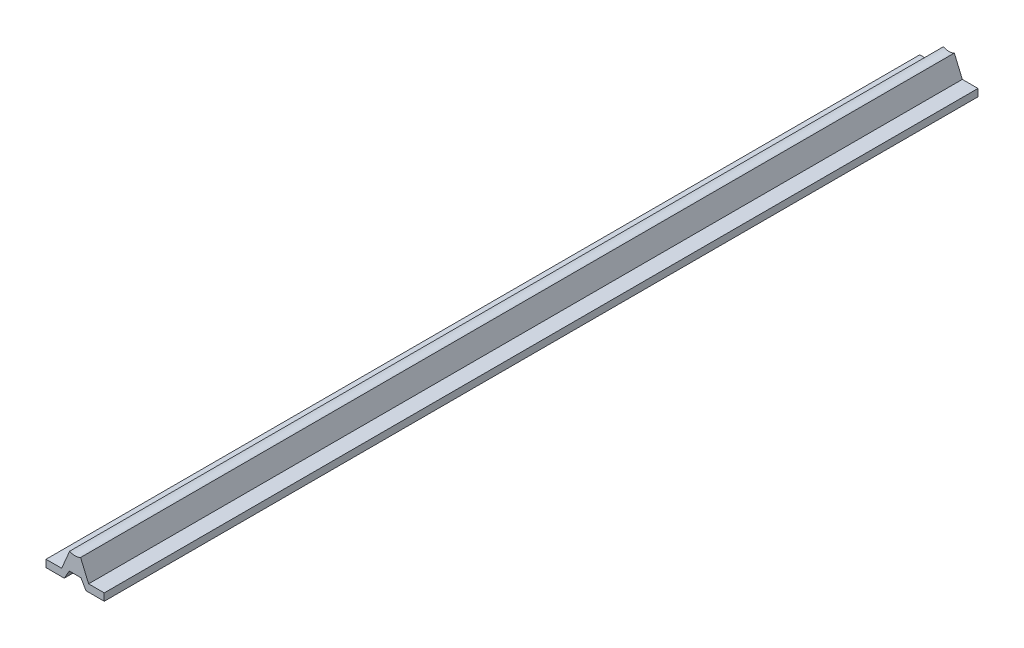
ISO-10303-21;
HEADER;
FILE_DESCRIPTION(('STEP AP214'),'2;1');
FILE_NAME('part.step','',(''),(''),'','','');
FILE_SCHEMA(('AUTOMOTIVE_DESIGN { 1 0 10303 214 1 1 1 1 }'));
ENDSEC;
DATA;
#1=APPLICATION_CONTEXT('core data for automotive mechanical design processes');
#2=APPLICATION_PROTOCOL_DEFINITION('international standard','automotive_design',2000,#1);
#3=PRODUCT_CONTEXT('',#1,'mechanical');
#4=PRODUCT('Part','Part','',(#3));
#5=PRODUCT_RELATED_PRODUCT_CATEGORY('part','',(#4));
#6=PRODUCT_DEFINITION_FORMATION('','',#4);
#7=PRODUCT_DEFINITION_CONTEXT('part definition',#1,'design');
#8=PRODUCT_DEFINITION('design','',#6,#7);
#9=PRODUCT_DEFINITION_SHAPE('','',#8);
#10=(LENGTH_UNIT() NAMED_UNIT(*) SI_UNIT(.MILLI.,.METRE.));
#11=(NAMED_UNIT(*) PLANE_ANGLE_UNIT() SI_UNIT($,.RADIAN.));
#12=(NAMED_UNIT(*) SI_UNIT($,.STERADIAN.) SOLID_ANGLE_UNIT());
#13=UNCERTAINTY_MEASURE_WITH_UNIT(LENGTH_MEASURE(1.E-05),#10,'distance_accuracy_value','');
#14=(GEOMETRIC_REPRESENTATION_CONTEXT(3) GLOBAL_UNCERTAINTY_ASSIGNED_CONTEXT((#13)) GLOBAL_UNIT_ASSIGNED_CONTEXT((#10,
#11,#12)) REPRESENTATION_CONTEXT('',''));
#15=CARTESIAN_POINT('',(0.,0.,0.));
#16=DIRECTION('',(0.,0.,1.));
#17=DIRECTION('',(1.,0.,0.));
#18=AXIS2_PLACEMENT_3D('',#15,#16,#17);
#19=CARTESIAN_POINT('',(-20.,-25.,600.));
#20=DIRECTION('',(1.,0.,0.));
#21=DIRECTION('',(0.,0.,-1.));
#22=AXIS2_PLACEMENT_3D('',#19,#20,#21);
#23=PLANE('',#22);
#24=DIRECTION('',(0.,-1.,0.));
#25=VECTOR('',#24,1.);
#26=CARTESIAN_POINT('',(-20.,-25.,0.));
#27=LINE('',#26,#25);
#28=CARTESIAN_POINT('',(-20.,-20.,0.));
#29=VERTEX_POINT('',#28);
#30=CARTESIAN_POINT('',(-20.,-25.,0.));
#31=VERTEX_POINT('',#30);
#32=EDGE_CURVE('E153',#29,#31,#27,.T.);
#33=ORIENTED_EDGE('',*,*,#32,.T.);
#34=DIRECTION('',(0.,0.,-1.));
#35=VECTOR('',#34,1.);
#36=CARTESIAN_POINT('',(-20.,-25.,600.));
#37=LINE('',#36,#35);
#38=CARTESIAN_POINT('',(-20.,-25.,600.));
#39=VERTEX_POINT('',#38);
#40=EDGE_CURVE('E11',#39,#31,#37,.T.);
#41=ORIENTED_EDGE('',*,*,#40,.F.);
#42=DIRECTION('',(0.,-1.,0.));
#43=VECTOR('',#42,1.);
#44=CARTESIAN_POINT('',(-20.,-25.,600.));
#45=LINE('',#44,#43);
#46=CARTESIAN_POINT('',(-20.,-20.,600.));
#47=VERTEX_POINT('',#46);
#48=EDGE_CURVE('E175',#47,#39,#45,.T.);
#49=ORIENTED_EDGE('',*,*,#48,.F.);
#50=DIRECTION('',(0.,0.,-1.));
#51=VECTOR('',#50,1.);
#52=CARTESIAN_POINT('',(-20.,-20.,600.));
#53=LINE('',#52,#51);
#54=EDGE_CURVE('E149',#47,#29,#53,.T.);
#55=ORIENTED_EDGE('',*,*,#54,.T.);
#56=EDGE_LOOP('',(#33,#41,#49,#55));
#57=FACE_BOUND('',#56,.T.);
#58=ADVANCED_FACE('F33',(#57),#23,.F.);
#59=CARTESIAN_POINT('',(-20.,-25.,600.));
#60=DIRECTION('',(0.,1.,0.));
#61=DIRECTION('',(0.,0.,1.));
#62=AXIS2_PLACEMENT_3D('',#59,#60,#61);
#63=PLANE('',#62);
#64=DIRECTION('',(1.,0.,0.));
#65=VECTOR('',#64,1.);
#66=CARTESIAN_POINT('',(-20.,-25.,0.));
#67=LINE('',#66,#65);
#68=CARTESIAN_POINT('',(-7.46410161513775,-25.,0.));
#69=VERTEX_POINT('',#68);
#70=EDGE_CURVE('E156',#31,#69,#67,.T.);
#71=ORIENTED_EDGE('',*,*,#70,.T.);
#72=DIRECTION('',(0.,0.,-1.));
#73=VECTOR('',#72,1.);
#74=CARTESIAN_POINT('',(-7.46410161513775,-25.,600.));
#75=LINE('',#74,#73);
#76=CARTESIAN_POINT('',(-7.46410161513775,-25.,600.));
#77=VERTEX_POINT('',#76);
#78=EDGE_CURVE('E41',#77,#69,#75,.T.);
#79=ORIENTED_EDGE('',*,*,#78,.F.);
#80=DIRECTION('',(1.,0.,0.));
#81=VECTOR('',#80,1.);
#82=CARTESIAN_POINT('',(-20.,-25.,600.));
#83=LINE('',#82,#81);
#84=EDGE_CURVE('E104',#39,#77,#83,.T.);
#85=ORIENTED_EDGE('',*,*,#84,.F.);
#86=ORIENTED_EDGE('',*,*,#40,.T.);
#87=EDGE_LOOP('',(#71,#79,#85,#86));
#88=FACE_BOUND('',#87,.T.);
#89=ADVANCED_FACE('F253',(#88),#63,.F.);
#90=CARTESIAN_POINT('',(-7.46410161513775,-25.,600.));
#91=DIRECTION('',(-0.866025403784439,0.5,0.));
#92=DIRECTION('',(-0.5,-0.866025403784439,0.));
#93=AXIS2_PLACEMENT_3D('',#90,#91,#92);
#94=PLANE('',#93);
#95=DIRECTION('',(0.5,0.866025403784439,0.));
#96=VECTOR('',#95,1.);
#97=CARTESIAN_POINT('',(-7.46410161513775,-25.,0.));
#98=LINE('',#97,#96);
#99=CARTESIAN_POINT('',(-4.,-19.,0.));
#100=VERTEX_POINT('',#99);
#101=EDGE_CURVE('E158',#69,#100,#98,.T.);
#102=ORIENTED_EDGE('',*,*,#101,.T.);
#103=DIRECTION('',(0.,0.,-1.));
#104=VECTOR('',#103,1.);
#105=CARTESIAN_POINT('',(-4.,-19.,600.));
#106=LINE('',#105,#104);
#107=CARTESIAN_POINT('',(-4.,-19.,600.));
#108=VERTEX_POINT('',#107);
#109=EDGE_CURVE('E194',#108,#100,#106,.T.);
#110=ORIENTED_EDGE('',*,*,#109,.F.);
#111=DIRECTION('',(0.5,0.866025403784439,0.));
#112=VECTOR('',#111,1.);
#113=CARTESIAN_POINT('',(-7.46410161513775,-25.,600.));
#114=LINE('',#113,#112);
#115=EDGE_CURVE('E202',#77,#108,#114,.T.);
#116=ORIENTED_EDGE('',*,*,#115,.F.);
#117=ORIENTED_EDGE('',*,*,#78,.T.);
#118=EDGE_LOOP('',(#102,#110,#116,#117));
#119=FACE_BOUND('',#118,.T.);
#120=ADVANCED_FACE('F200',(#119),#94,.F.);
#121=CARTESIAN_POINT('',(-4.,-19.,600.));
#122=DIRECTION('',(0.,1.,0.));
#123=DIRECTION('',(0.,0.,1.));
#124=AXIS2_PLACEMENT_3D('',#121,#122,#123);
#125=PLANE('',#124);
#126=DIRECTION('',(1.,0.,0.));
#127=VECTOR('',#126,1.);
#128=CARTESIAN_POINT('',(-4.,-19.,0.));
#129=LINE('',#128,#127);
#130=CARTESIAN_POINT('',(4.,-19.,0.));
#131=VERTEX_POINT('',#130);
#132=EDGE_CURVE('E160',#100,#131,#129,.T.);
#133=ORIENTED_EDGE('',*,*,#132,.T.);
#134=DIRECTION('',(0.,0.,-1.));
#135=VECTOR('',#134,1.);
#136=CARTESIAN_POINT('',(4.,-19.,600.));
#137=LINE('',#136,#135);
#138=CARTESIAN_POINT('',(4.,-19.,600.));
#139=VERTEX_POINT('',#138);
#140=EDGE_CURVE('E191',#139,#131,#137,.T.);
#141=ORIENTED_EDGE('',*,*,#140,.F.);
#142=DIRECTION('',(1.,0.,0.));
#143=VECTOR('',#142,1.);
#144=CARTESIAN_POINT('',(-4.,-19.,600.));
#145=LINE('',#144,#143);
#146=EDGE_CURVE('E220',#108,#139,#145,.T.);
#147=ORIENTED_EDGE('',*,*,#146,.F.);
#148=ORIENTED_EDGE('',*,*,#109,.T.);
#149=EDGE_LOOP('',(#133,#141,#147,#148));
#150=FACE_BOUND('',#149,.T.);
#151=ADVANCED_FACE('F211',(#150),#125,.F.);
#152=CARTESIAN_POINT('',(4.,-19.,600.));
#153=DIRECTION('',(0.866025403784439,0.499999999999999,0.));
#154=DIRECTION('',(-0.499999999999999,0.866025403784439,0.));
#155=AXIS2_PLACEMENT_3D('',#152,#153,#154);
#156=PLANE('',#155);
#157=DIRECTION('',(0.499999999999999,-0.866025403784439,0.));
#158=VECTOR('',#157,1.);
#159=CARTESIAN_POINT('',(4.,-19.,0.));
#160=LINE('',#159,#158);
#161=CARTESIAN_POINT('',(7.46410161513775,-25.,0.));
#162=VERTEX_POINT('',#161);
#163=EDGE_CURVE('E162',#131,#162,#160,.T.);
#164=ORIENTED_EDGE('',*,*,#163,.T.);
#165=DIRECTION('',(0.,0.,-1.));
#166=VECTOR('',#165,1.);
#167=CARTESIAN_POINT('',(7.46410161513775,-25.,600.));
#168=LINE('',#167,#166);
#169=CARTESIAN_POINT('',(7.46410161513775,-25.,600.));
#170=VERTEX_POINT('',#169);
#171=EDGE_CURVE('E188',#170,#162,#168,.T.);
#172=ORIENTED_EDGE('',*,*,#171,.F.);
#173=DIRECTION('',(0.499999999999999,-0.866025403784439,0.));
#174=VECTOR('',#173,1.);
#175=CARTESIAN_POINT('',(4.,-19.,600.));
#176=LINE('',#175,#174);
#177=EDGE_CURVE('E217',#139,#170,#176,.T.);
#178=ORIENTED_EDGE('',*,*,#177,.F.);
#179=ORIENTED_EDGE('',*,*,#140,.T.);
#180=EDGE_LOOP('',(#164,#172,#178,#179));
#181=FACE_BOUND('',#180,.T.);
#182=ADVANCED_FACE('F215',(#181),#156,.F.);
#183=CARTESIAN_POINT('',(7.46410161513775,-25.,600.));
#184=DIRECTION('',(0.,1.,0.));
#185=DIRECTION('',(-1.,0.,0.));
#186=AXIS2_PLACEMENT_3D('',#183,#184,#185);
#187=PLANE('',#186);
#188=DIRECTION('',(1.,0.,0.));
#189=VECTOR('',#188,1.);
#190=CARTESIAN_POINT('',(7.46410161513775,-25.,0.));
#191=LINE('',#190,#189);
#192=CARTESIAN_POINT('',(20.,-25.,0.));
#193=VERTEX_POINT('',#192);
#194=EDGE_CURVE('E164',#162,#193,#191,.T.);
#195=ORIENTED_EDGE('',*,*,#194,.T.);
#196=DIRECTION('',(0.,0.,-1.));
#197=VECTOR('',#196,1.);
#198=CARTESIAN_POINT('',(20.,-25.,600.));
#199=LINE('',#198,#197);
#200=CARTESIAN_POINT('',(20.,-25.,600.));
#201=VERTEX_POINT('',#200);
#202=EDGE_CURVE('E185',#201,#193,#199,.T.);
#203=ORIENTED_EDGE('',*,*,#202,.F.);
#204=DIRECTION('',(1.,0.,0.));
#205=VECTOR('',#204,1.);
#206=CARTESIAN_POINT('',(7.46410161513775,-25.,600.));
#207=LINE('',#206,#205);
#208=EDGE_CURVE('E219',#170,#201,#207,.T.);
#209=ORIENTED_EDGE('',*,*,#208,.F.);
#210=ORIENTED_EDGE('',*,*,#171,.T.);
#211=EDGE_LOOP('',(#195,#203,#209,#210));
#212=FACE_BOUND('',#211,.T.);
#213=ADVANCED_FACE('F266',(#212),#187,.F.);
#214=CARTESIAN_POINT('',(20.,-25.,600.));
#215=DIRECTION('',(-1.,0.,0.));
#216=DIRECTION('',(0.,0.,1.));
#217=AXIS2_PLACEMENT_3D('',#214,#215,#216);
#218=PLANE('',#217);
#219=DIRECTION('',(0.,1.,0.));
#220=VECTOR('',#219,1.);
#221=CARTESIAN_POINT('',(20.,-25.,0.));
#222=LINE('',#221,#220);
#223=CARTESIAN_POINT('',(20.,-20.,0.));
#224=VERTEX_POINT('',#223);
#225=EDGE_CURVE('E166',#193,#224,#222,.T.);
#226=ORIENTED_EDGE('',*,*,#225,.T.);
#227=DIRECTION('',(0.,0.,-1.));
#228=VECTOR('',#227,1.);
#229=CARTESIAN_POINT('',(20.,-20.,600.));
#230=LINE('',#229,#228);
#231=CARTESIAN_POINT('',(20.,-20.,600.));
#232=VERTEX_POINT('',#231);
#233=EDGE_CURVE('E182',#232,#224,#230,.T.);
#234=ORIENTED_EDGE('',*,*,#233,.F.);
#235=DIRECTION('',(0.,1.,0.));
#236=VECTOR('',#235,1.);
#237=CARTESIAN_POINT('',(20.,-25.,600.));
#238=LINE('',#237,#236);
#239=EDGE_CURVE('E222',#201,#232,#238,.T.);
#240=ORIENTED_EDGE('',*,*,#239,.F.);
#241=ORIENTED_EDGE('',*,*,#202,.T.);
#242=EDGE_LOOP('',(#226,#234,#240,#241));
#243=FACE_BOUND('',#242,.T.);
#244=ADVANCED_FACE('F269',(#243),#218,.F.);
#245=CARTESIAN_POINT('',(20.,-20.,600.));
#246=DIRECTION('',(0.,-1.,0.));
#247=DIRECTION('',(0.,0.,-1.));
#248=AXIS2_PLACEMENT_3D('',#245,#246,#247);
#249=PLANE('',#248);
#250=DIRECTION('',(-1.,0.,0.));
#251=VECTOR('',#250,1.);
#252=CARTESIAN_POINT('',(20.,-20.,0.));
#253=LINE('',#252,#251);
#254=CARTESIAN_POINT('',(9.25,-20.,0.));
#255=VERTEX_POINT('',#254);
#256=EDGE_CURVE('E168',#224,#255,#253,.T.);
#257=ORIENTED_EDGE('',*,*,#256,.T.);
#258=DIRECTION('',(0.,0.,-1.));
#259=VECTOR('',#258,1.);
#260=CARTESIAN_POINT('',(9.25,-20.,600.));
#261=LINE('',#260,#259);
#262=CARTESIAN_POINT('',(9.25,-20.,600.));
#263=VERTEX_POINT('',#262);
#264=EDGE_CURVE('E179',#263,#255,#261,.T.);
#265=ORIENTED_EDGE('',*,*,#264,.F.);
#266=DIRECTION('',(-1.,0.,0.));
#267=VECTOR('',#266,1.);
#268=CARTESIAN_POINT('',(20.,-20.,600.));
#269=LINE('',#268,#267);
#270=EDGE_CURVE('E228',#232,#263,#269,.T.);
#271=ORIENTED_EDGE('',*,*,#270,.F.);
#272=ORIENTED_EDGE('',*,*,#233,.T.);
#273=EDGE_LOOP('',(#257,#265,#271,#272));
#274=FACE_BOUND('',#273,.T.);
#275=ADVANCED_FACE('F234',(#274),#249,.F.);
#276=CARTESIAN_POINT('',(3.75,-7.06664701255129,600.));
#277=DIRECTION('',(-0.920245732120231,-0.391341018185547,0.));
#278=DIRECTION('',(0.391341018185547,-0.920245732120231,0.));
#279=AXIS2_PLACEMENT_3D('',#276,#277,#278);
#280=PLANE('',#279);
#281=DIRECTION('',(-0.391341018185547,0.920245732120231,0.));
#282=VECTOR('',#281,1.);
#283=CARTESIAN_POINT('',(3.75,-7.06664701255129,0.));
#284=LINE('',#283,#282);
#285=CARTESIAN_POINT('',(3.75,-7.06664701255129,0.));
#286=VERTEX_POINT('',#285);
#287=EDGE_CURVE('E170',#255,#286,#284,.T.);
#288=ORIENTED_EDGE('',*,*,#287,.T.);
#289=DIRECTION('',(0.,0.,-1.));
#290=VECTOR('',#289,1.);
#291=CARTESIAN_POINT('',(3.75,-7.06664701255129,600.));
#292=LINE('',#291,#290);
#293=CARTESIAN_POINT('',(3.75,-7.06664701255129,600.));
#294=VERTEX_POINT('',#293);
#295=EDGE_CURVE('E144',#294,#286,#292,.T.);
#296=ORIENTED_EDGE('',*,*,#295,.F.);
#297=DIRECTION('',(-0.391341018185547,0.920245732120231,0.));
#298=VECTOR('',#297,1.);
#299=CARTESIAN_POINT('',(3.75,-7.06664701255129,600.));
#300=LINE('',#299,#298);
#301=EDGE_CURVE('E135',#263,#294,#300,.T.);
#302=ORIENTED_EDGE('',*,*,#301,.F.);
#303=ORIENTED_EDGE('',*,*,#264,.T.);
#304=EDGE_LOOP('',(#288,#296,#302,#303));
#305=FACE_BOUND('',#304,.T.);
#306=ADVANCED_FACE('F238',(#305),#280,.F.);
#307=CARTESIAN_POINT('',(0.,0.,600.));
#308=DIRECTION('',(0.,0.,-1.));
#309=DIRECTION('',(-1.,0.,0.));
#310=AXIS2_PLACEMENT_3D('',#307,#308,#309);
#311=CYLINDRICAL_SURFACE('',#310,8.);
#312=CARTESIAN_POINT('',(0.,0.,0.));
#313=DIRECTION('',(0.,0.,-1.));
#314=DIRECTION('',(1.,0.,0.));
#315=AXIS2_PLACEMENT_3D('',#312,#313,#314);
#316=CIRCLE('',#315,8.);
#317=CARTESIAN_POINT('',(-3.75000000000001,-7.06664701255128,0.));
#318=VERTEX_POINT('',#317);
#319=EDGE_CURVE('E143',#286,#318,#316,.T.);
#320=ORIENTED_EDGE('',*,*,#319,.T.);
#321=DIRECTION('',(0.,0.,-1.));
#322=VECTOR('',#321,1.);
#323=CARTESIAN_POINT('',(-3.75000000000001,-7.06664701255128,600.));
#324=LINE('',#323,#322);
#325=CARTESIAN_POINT('',(-3.75000000000001,-7.06664701255128,600.));
#326=VERTEX_POINT('',#325);
#327=EDGE_CURVE('E140',#326,#318,#324,.T.);
#328=ORIENTED_EDGE('',*,*,#327,.F.);
#329=CARTESIAN_POINT('',(0.,0.,600.));
#330=DIRECTION('',(0.,0.,-1.));
#331=DIRECTION('',(1.,0.,0.));
#332=AXIS2_PLACEMENT_3D('',#329,#330,#331);
#333=CIRCLE('',#332,8.);
#334=EDGE_CURVE('E129',#294,#326,#333,.T.);
#335=ORIENTED_EDGE('',*,*,#334,.F.);
#336=ORIENTED_EDGE('',*,*,#295,.T.);
#337=EDGE_LOOP('',(#320,#328,#335,#336));
#338=FACE_BOUND('',#337,.T.);
#339=ADVANCED_FACE('F141',(#338),#311,.F.);
#340=CARTESIAN_POINT('',(-9.25,-20.,600.));
#341=DIRECTION('',(0.920245732120231,-0.391341018185547,0.));
#342=DIRECTION('',(0.391341018185547,0.920245732120231,0.));
#343=AXIS2_PLACEMENT_3D('',#340,#341,#342);
#344=PLANE('',#343);
#345=DIRECTION('',(-0.391341018185547,-0.920245732120231,0.));
#346=VECTOR('',#345,1.);
#347=CARTESIAN_POINT('',(-9.25,-20.,0.));
#348=LINE('',#347,#346);
#349=CARTESIAN_POINT('',(-9.25,-20.,0.));
#350=VERTEX_POINT('',#349);
#351=EDGE_CURVE('E90',#318,#350,#348,.T.);
#352=ORIENTED_EDGE('',*,*,#351,.T.);
#353=DIRECTION('',(0.,0.,-1.));
#354=VECTOR('',#353,1.);
#355=CARTESIAN_POINT('',(-9.25,-20.,600.));
#356=LINE('',#355,#354);
#357=CARTESIAN_POINT('',(-9.25,-20.,600.));
#358=VERTEX_POINT('',#357);
#359=EDGE_CURVE('E145',#358,#350,#356,.T.);
#360=ORIENTED_EDGE('',*,*,#359,.F.);
#361=DIRECTION('',(-0.391341018185547,-0.920245732120231,0.));
#362=VECTOR('',#361,1.);
#363=CARTESIAN_POINT('',(-9.25,-20.,600.));
#364=LINE('',#363,#362);
#365=EDGE_CURVE('E133',#326,#358,#364,.T.);
#366=ORIENTED_EDGE('',*,*,#365,.F.);
#367=ORIENTED_EDGE('',*,*,#327,.T.);
#368=EDGE_LOOP('',(#352,#360,#366,#367));
#369=FACE_BOUND('',#368,.T.);
#370=ADVANCED_FACE('F147',(#369),#344,.F.);
#371=CARTESIAN_POINT('',(-20.,-20.,600.));
#372=DIRECTION('',(0.,-1.,0.));
#373=DIRECTION('',(1.,0.,0.));
#374=AXIS2_PLACEMENT_3D('',#371,#372,#373);
#375=PLANE('',#374);
#376=DIRECTION('',(-1.,0.,0.));
#377=VECTOR('',#376,1.);
#378=CARTESIAN_POINT('',(-20.,-20.,0.));
#379=LINE('',#378,#377);
#380=EDGE_CURVE('E96',#350,#29,#379,.T.);
#381=ORIENTED_EDGE('',*,*,#380,.T.);
#382=ORIENTED_EDGE('',*,*,#54,.F.);
#383=DIRECTION('',(-1.,0.,0.));
#384=VECTOR('',#383,1.);
#385=CARTESIAN_POINT('',(-20.,-20.,600.));
#386=LINE('',#385,#384);
#387=EDGE_CURVE('E49',#358,#47,#386,.T.);
#388=ORIENTED_EDGE('',*,*,#387,.F.);
#389=ORIENTED_EDGE('',*,*,#359,.T.);
#390=EDGE_LOOP('',(#381,#382,#388,#389));
#391=FACE_BOUND('',#390,.T.);
#392=ADVANCED_FACE('F242',(#391),#375,.F.);
#393=CARTESIAN_POINT('',(0.,0.,600.));
#394=DIRECTION('',(0.,0.,1.));
#395=DIRECTION('',(1.,0.,0.));
#396=AXIS2_PLACEMENT_3D('',#393,#394,#395);
#397=PLANE('',#396);
#398=ORIENTED_EDGE('',*,*,#48,.T.);
#399=ORIENTED_EDGE('',*,*,#84,.T.);
#400=ORIENTED_EDGE('',*,*,#115,.T.);
#401=ORIENTED_EDGE('',*,*,#146,.T.);
#402=ORIENTED_EDGE('',*,*,#177,.T.);
#403=ORIENTED_EDGE('',*,*,#208,.T.);
#404=ORIENTED_EDGE('',*,*,#239,.T.);
#405=ORIENTED_EDGE('',*,*,#270,.T.);
#406=ORIENTED_EDGE('',*,*,#301,.T.);
#407=ORIENTED_EDGE('',*,*,#334,.T.);
#408=ORIENTED_EDGE('',*,*,#365,.T.);
#409=ORIENTED_EDGE('',*,*,#387,.T.);
#410=EDGE_LOOP('',(#398,#399,#400,#401,#402,#403,#404,#405,#406,#407,#408,#409));
#411=FACE_BOUND('',#410,.T.);
#412=ADVANCED_FACE('F131',(#411),#397,.T.);
#413=CARTESIAN_POINT('',(0.,0.,0.));
#414=DIRECTION('',(0.,0.,1.));
#415=DIRECTION('',(1.,0.,0.));
#416=AXIS2_PLACEMENT_3D('',#413,#414,#415);
#417=PLANE('',#416);
#418=ORIENTED_EDGE('',*,*,#32,.F.);
#419=ORIENTED_EDGE('',*,*,#380,.F.);
#420=ORIENTED_EDGE('',*,*,#351,.F.);
#421=ORIENTED_EDGE('',*,*,#319,.F.);
#422=ORIENTED_EDGE('',*,*,#287,.F.);
#423=ORIENTED_EDGE('',*,*,#256,.F.);
#424=ORIENTED_EDGE('',*,*,#225,.F.);
#425=ORIENTED_EDGE('',*,*,#194,.F.);
#426=ORIENTED_EDGE('',*,*,#163,.F.);
#427=ORIENTED_EDGE('',*,*,#132,.F.);
#428=ORIENTED_EDGE('',*,*,#101,.F.);
#429=ORIENTED_EDGE('',*,*,#70,.F.);
#430=EDGE_LOOP('',(#418,#419,#420,#421,#422,#423,#424,#425,#426,#427,#428,#429));
#431=FACE_BOUND('',#430,.T.);
#432=ADVANCED_FACE('F206',(#431),#417,.F.);
#433=CLOSED_SHELL('',(#58,#89,#120,#151,#182,#213,#244,#275,#306,#339,#370,#392,#412,#432));
#434=MANIFOLD_SOLID_BREP('B2',#433);
#435=ADVANCED_BREP_SHAPE_REPRESENTATION('',(#18,#434),#14);
#436=SHAPE_DEFINITION_REPRESENTATION(#9,#435);
ENDSEC;
END-ISO-10303-21;
